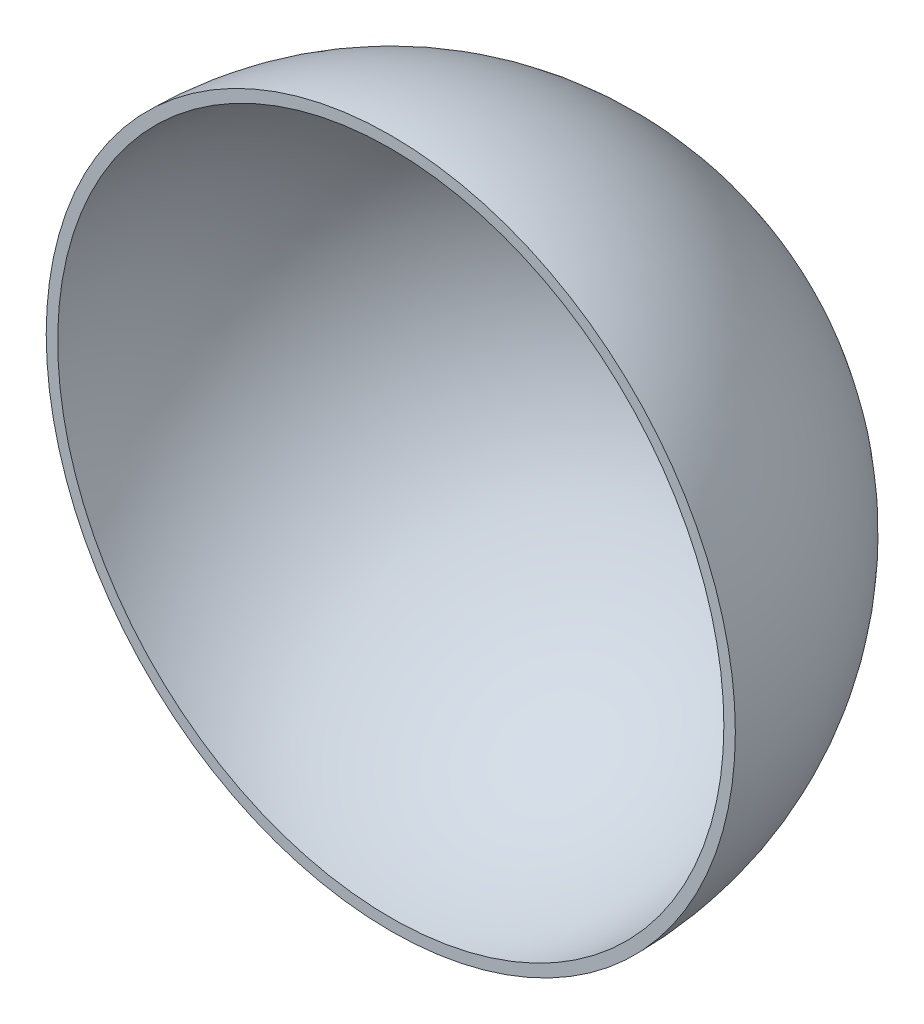
ISO-10303-21;
HEADER;
FILE_DESCRIPTION(('STEP AP214'),'2;1');
FILE_NAME('part.step','',(''),(''),'','','');
FILE_SCHEMA(('AUTOMOTIVE_DESIGN { 1 0 10303 214 1 1 1 1 }'));
ENDSEC;
DATA;
#1=APPLICATION_CONTEXT('core data for automotive mechanical design processes');
#2=APPLICATION_PROTOCOL_DEFINITION('international standard','automotive_design',2000,#1);
#3=PRODUCT_CONTEXT('',#1,'mechanical');
#4=PRODUCT('Part','Part','',(#3));
#5=PRODUCT_RELATED_PRODUCT_CATEGORY('part','',(#4));
#6=PRODUCT_DEFINITION_FORMATION('','',#4);
#7=PRODUCT_DEFINITION_CONTEXT('part definition',#1,'design');
#8=PRODUCT_DEFINITION('design','',#6,#7);
#9=PRODUCT_DEFINITION_SHAPE('','',#8);
#10=(LENGTH_UNIT() NAMED_UNIT(*) SI_UNIT(.MILLI.,.METRE.));
#11=(NAMED_UNIT(*) PLANE_ANGLE_UNIT() SI_UNIT($,.RADIAN.));
#12=(NAMED_UNIT(*) SI_UNIT($,.STERADIAN.) SOLID_ANGLE_UNIT());
#13=UNCERTAINTY_MEASURE_WITH_UNIT(LENGTH_MEASURE(1.E-05),#10,'distance_accuracy_value','');
#14=(GEOMETRIC_REPRESENTATION_CONTEXT(3) GLOBAL_UNCERTAINTY_ASSIGNED_CONTEXT((#13)) GLOBAL_UNIT_ASSIGNED_CONTEXT((#10,
#11,#12)) REPRESENTATION_CONTEXT('',''));
#15=CARTESIAN_POINT('',(0.,0.,0.));
#16=DIRECTION('',(0.,0.,1.));
#17=DIRECTION('',(1.,0.,0.));
#18=AXIS2_PLACEMENT_3D('',#15,#16,#17);
#19=CARTESIAN_POINT('',(0.,0.,0.));
#20=DIRECTION('',(0.,0.,1.));
#21=DIRECTION('',(0.,1.,0.));
#22=AXIS2_PLACEMENT_3D('',#19,#20,#21);
#23=SPHERICAL_SURFACE('',#22,29.);
#24=CARTESIAN_POINT('',(0.,0.,0.));
#25=DIRECTION('',(0.,0.,1.));
#26=DIRECTION('',(1.,0.,0.));
#27=AXIS2_PLACEMENT_3D('',#24,#25,#26);
#28=CIRCLE('',#27,29.);
#29=CARTESIAN_POINT('',(29.,0.,0.));
#30=VERTEX_POINT('',#29);
#31=EDGE_CURVE('E40',#30,#30,#28,.T.);
#32=ORIENTED_EDGE('',*,*,#31,.T.);
#33=EDGE_LOOP('',(#32));
#34=FACE_BOUND('',#33,.T.);
#35=ADVANCED_FACE('F34',(#34),#23,.F.);
#36=CARTESIAN_POINT('',(0.,0.,0.));
#37=DIRECTION('',(0.,0.,1.));
#38=DIRECTION('',(0.,1.,0.));
#39=AXIS2_PLACEMENT_3D('',#36,#37,#38);
#40=SPHERICAL_SURFACE('',#39,30.);
#41=CARTESIAN_POINT('',(0.,0.,0.));
#42=DIRECTION('',(0.,0.,1.));
#43=DIRECTION('',(1.,0.,0.));
#44=AXIS2_PLACEMENT_3D('',#41,#42,#43);
#45=CIRCLE('',#44,30.);
#46=CARTESIAN_POINT('',(30.,0.,0.));
#47=VERTEX_POINT('',#46);
#48=EDGE_CURVE('E10',#47,#47,#45,.T.);
#49=ORIENTED_EDGE('',*,*,#48,.F.);
#50=EDGE_LOOP('',(#49));
#51=FACE_BOUND('',#50,.T.);
#52=ADVANCED_FACE('F49',(#51),#40,.T.);
#53=CARTESIAN_POINT('',(0.,0.,0.));
#54=DIRECTION('',(0.,0.,-1.));
#55=DIRECTION('',(-1.,0.,0.));
#56=AXIS2_PLACEMENT_3D('',#53,#54,#55);
#57=PLANE('',#56);
#58=ORIENTED_EDGE('',*,*,#31,.F.);
#59=EDGE_LOOP('',(#58));
#60=FACE_BOUND('',#59,.T.);
#61=ORIENTED_EDGE('',*,*,#48,.T.);
#62=EDGE_LOOP('',(#61));
#63=FACE_BOUND('',#62,.T.);
#64=ADVANCED_FACE('F47',(#60,#63),#57,.F.);
#65=CLOSED_SHELL('',(#35,#52,#64));
#66=MANIFOLD_SOLID_BREP('B2',#65);
#67=ADVANCED_BREP_SHAPE_REPRESENTATION('',(#18,#66),#14);
#68=SHAPE_DEFINITION_REPRESENTATION(#9,#67);
ENDSEC;
END-ISO-10303-21;
